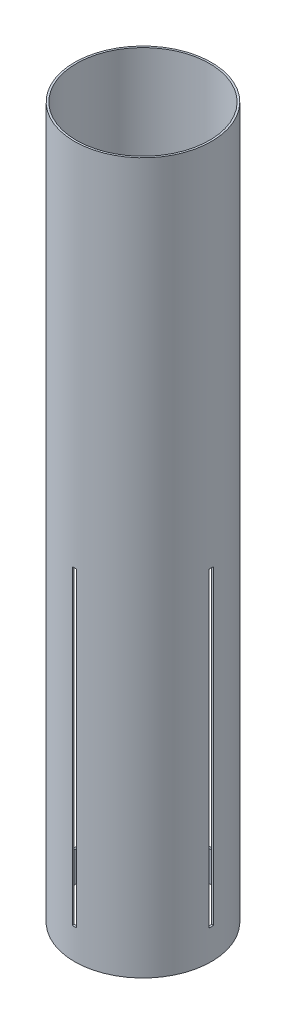
ISO-10303-21;
HEADER;
FILE_DESCRIPTION(('STEP AP214'),'2;1');
FILE_NAME('part.step','',(''),(''),'','','');
FILE_SCHEMA(('AUTOMOTIVE_DESIGN { 1 0 10303 214 1 1 1 1 }'));
ENDSEC;
DATA;
#1=APPLICATION_CONTEXT('core data for automotive mechanical design processes');
#2=APPLICATION_PROTOCOL_DEFINITION('international standard','automotive_design',2000,#1);
#3=PRODUCT_CONTEXT('',#1,'mechanical');
#4=PRODUCT('Part','Part','',(#3));
#5=PRODUCT_RELATED_PRODUCT_CATEGORY('part','',(#4));
#6=PRODUCT_DEFINITION_FORMATION('','',#4);
#7=PRODUCT_DEFINITION_CONTEXT('part definition',#1,'design');
#8=PRODUCT_DEFINITION('design','',#6,#7);
#9=PRODUCT_DEFINITION_SHAPE('','',#8);
#10=(LENGTH_UNIT() NAMED_UNIT(*) SI_UNIT(.MILLI.,.METRE.));
#11=(NAMED_UNIT(*) PLANE_ANGLE_UNIT() SI_UNIT($,.RADIAN.));
#12=(NAMED_UNIT(*) SI_UNIT($,.STERADIAN.) SOLID_ANGLE_UNIT());
#13=UNCERTAINTY_MEASURE_WITH_UNIT(LENGTH_MEASURE(1.E-05),#10,'distance_accuracy_value','');
#14=(GEOMETRIC_REPRESENTATION_CONTEXT(3) GLOBAL_UNCERTAINTY_ASSIGNED_CONTEXT((#13)) GLOBAL_UNIT_ASSIGNED_CONTEXT((#10,
#11,#12)) REPRESENTATION_CONTEXT('',''));
#15=CARTESIAN_POINT('',(0.,0.,0.));
#16=DIRECTION('',(0.,0.,1.));
#17=DIRECTION('',(1.,0.,0.));
#18=AXIS2_PLACEMENT_3D('',#15,#16,#17);
#19=CARTESIAN_POINT('',(0.,812.8,0.));
#20=DIRECTION('',(0.,-1.,0.));
#21=DIRECTION('',(0.,0.,-1.));
#22=AXIS2_PLACEMENT_3D('',#19,#20,#21);
#23=CYLINDRICAL_SURFACE('',#22,78.359);
#24=CARTESIAN_POINT('',(0.,34.671,0.));
#25=DIRECTION('',(0.,1.,0.));
#26=DIRECTION('',(0.,0.,1.));
#27=AXIS2_PLACEMENT_3D('',#24,#25,#26);
#28=CIRCLE('',#27,78.359);
#29=CARTESIAN_POINT('',(-78.3178222437269,34.671,-2.53999999999918));
#30=VERTEX_POINT('',#29);
#31=CARTESIAN_POINT('',(-78.3178222437268,34.671,2.54000000000082));
#32=VERTEX_POINT('',#31);
#33=EDGE_CURVE('E68',#30,#32,#28,.T.);
#34=ORIENTED_EDGE('',*,*,#33,.F.);
#35=DIRECTION('',(0.,-1.,0.));
#36=VECTOR('',#35,1.);
#37=CARTESIAN_POINT('',(-78.3178222437269,812.8,-2.53999999999918));
#38=LINE('',#37,#36);
#39=CARTESIAN_POINT('',(-78.3178222437269,390.271,-2.53999999999918));
#40=VERTEX_POINT('',#39);
#41=EDGE_CURVE('E264',#40,#30,#38,.T.);
#42=ORIENTED_EDGE('',*,*,#41,.F.);
#43=CARTESIAN_POINT('',(0.,390.271,0.));
#44=DIRECTION('',(0.,1.,0.));
#45=DIRECTION('',(0.,0.,1.));
#46=AXIS2_PLACEMENT_3D('',#43,#44,#45);
#47=CIRCLE('',#46,78.359);
#48=CARTESIAN_POINT('',(-78.3178222437268,390.271,2.54000000000082));
#49=VERTEX_POINT('',#48);
#50=EDGE_CURVE('E189',#40,#49,#47,.T.);
#51=ORIENTED_EDGE('',*,*,#50,.T.);
#52=DIRECTION('',(0.,-1.,0.));
#53=VECTOR('',#52,1.);
#54=CARTESIAN_POINT('',(-78.3178222437268,812.8,2.54000000000082));
#55=LINE('',#54,#53);
#56=EDGE_CURVE('E185',#49,#32,#55,.T.);
#57=ORIENTED_EDGE('',*,*,#56,.T.);
#58=EDGE_LOOP('',(#34,#42,#51,#57));
#59=FACE_BOUND('',#58,.T.);
#60=CARTESIAN_POINT('',(0.,0.,0.));
#61=DIRECTION('',(0.,1.,0.));
#62=DIRECTION('',(0.,0.,1.));
#63=AXIS2_PLACEMENT_3D('',#60,#61,#62);
#64=CIRCLE('',#63,78.359);
#65=CARTESIAN_POINT('',(0.,0.,78.359));
#66=VERTEX_POINT('',#65);
#67=EDGE_CURVE('E48',#66,#66,#64,.T.);
#68=ORIENTED_EDGE('',*,*,#67,.T.);
#69=EDGE_LOOP('',(#68));
#70=FACE_BOUND('',#69,.T.);
#71=CARTESIAN_POINT('',(0.,812.8,0.));
#72=DIRECTION('',(0.,1.,0.));
#73=DIRECTION('',(0.,0.,1.));
#74=AXIS2_PLACEMENT_3D('',#71,#72,#73);
#75=CIRCLE('',#74,78.359);
#76=CARTESIAN_POINT('',(0.,812.8,78.359));
#77=VERTEX_POINT('',#76);
#78=EDGE_CURVE('E11',#77,#77,#75,.T.);
#79=ORIENTED_EDGE('',*,*,#78,.F.);
#80=EDGE_LOOP('',(#79));
#81=FACE_BOUND('',#80,.T.);
#82=CARTESIAN_POINT('',(0.,390.271,0.));
#83=DIRECTION('',(0.,1.,0.));
#84=DIRECTION('',(0.,0.,1.));
#85=AXIS2_PLACEMENT_3D('',#82,#83,#84);
#86=CIRCLE('',#85,78.359);
#87=CARTESIAN_POINT('',(-2.54,390.271,78.3178222437269));
#88=VERTEX_POINT('',#87);
#89=CARTESIAN_POINT('',(2.54,390.271,78.3178222437269));
#90=VERTEX_POINT('',#89);
#91=EDGE_CURVE('E326',#88,#90,#86,.T.);
#92=ORIENTED_EDGE('',*,*,#91,.T.);
#93=DIRECTION('',(0.,-1.,0.));
#94=VECTOR('',#93,1.);
#95=CARTESIAN_POINT('',(2.54,812.8,78.3178222437269));
#96=LINE('',#95,#94);
#97=CARTESIAN_POINT('',(2.54,34.671,78.3178222437269));
#98=VERTEX_POINT('',#97);
#99=EDGE_CURVE('E303',#90,#98,#96,.T.);
#100=ORIENTED_EDGE('',*,*,#99,.T.);
#101=CARTESIAN_POINT('',(0.,34.671,0.));
#102=DIRECTION('',(0.,1.,0.));
#103=DIRECTION('',(0.,0.,1.));
#104=AXIS2_PLACEMENT_3D('',#101,#102,#103);
#105=CIRCLE('',#104,78.359);
#106=CARTESIAN_POINT('',(-2.54,34.671,78.3178222437269));
#107=VERTEX_POINT('',#106);
#108=EDGE_CURVE('E333',#107,#98,#105,.T.);
#109=ORIENTED_EDGE('',*,*,#108,.F.);
#110=DIRECTION('',(0.,-1.,0.));
#111=VECTOR('',#110,1.);
#112=CARTESIAN_POINT('',(-2.54,812.8,78.3178222437269));
#113=LINE('',#112,#111);
#114=EDGE_CURVE('E329',#88,#107,#113,.T.);
#115=ORIENTED_EDGE('',*,*,#114,.F.);
#116=EDGE_LOOP('',(#92,#100,#109,#115));
#117=FACE_BOUND('',#116,.T.);
#118=CARTESIAN_POINT('',(0.,390.271,0.));
#119=DIRECTION('',(0.,1.,0.));
#120=DIRECTION('',(0.,0.,1.));
#121=AXIS2_PLACEMENT_3D('',#118,#119,#120);
#122=CIRCLE('',#121,78.359);
#123=CARTESIAN_POINT('',(2.54,390.271,-78.3178222437269));
#124=VERTEX_POINT('',#123);
#125=CARTESIAN_POINT('',(-2.54,390.271,-78.3178222437269));
#126=VERTEX_POINT('',#125);
#127=EDGE_CURVE('E275',#124,#126,#122,.T.);
#128=ORIENTED_EDGE('',*,*,#127,.T.);
#129=DIRECTION('',(0.,-1.,0.));
#130=VECTOR('',#129,1.);
#131=CARTESIAN_POINT('',(-2.54,812.8,-78.3178222437269));
#132=LINE('',#131,#130);
#133=CARTESIAN_POINT('',(-2.54,34.671,-78.3178222437269));
#134=VERTEX_POINT('',#133);
#135=EDGE_CURVE('E278',#126,#134,#132,.T.);
#136=ORIENTED_EDGE('',*,*,#135,.T.);
#137=CARTESIAN_POINT('',(0.,34.671,0.));
#138=DIRECTION('',(0.,1.,0.));
#139=DIRECTION('',(0.,0.,1.));
#140=AXIS2_PLACEMENT_3D('',#137,#138,#139);
#141=CIRCLE('',#140,78.359);
#142=CARTESIAN_POINT('',(2.54,34.671,-78.3178222437269));
#143=VERTEX_POINT('',#142);
#144=EDGE_CURVE('E269',#143,#134,#141,.T.);
#145=ORIENTED_EDGE('',*,*,#144,.F.);
#146=DIRECTION('',(0.,-1.,0.));
#147=VECTOR('',#146,1.);
#148=CARTESIAN_POINT('',(2.54,812.8,-78.3178222437269));
#149=LINE('',#148,#147);
#150=EDGE_CURVE('E272',#124,#143,#149,.T.);
#151=ORIENTED_EDGE('',*,*,#150,.F.);
#152=EDGE_LOOP('',(#128,#136,#145,#151));
#153=FACE_BOUND('',#152,.T.);
#154=CARTESIAN_POINT('',(0.,34.671,0.));
#155=DIRECTION('',(0.,1.,0.));
#156=DIRECTION('',(0.,0.,1.));
#157=AXIS2_PLACEMENT_3D('',#154,#155,#156);
#158=CIRCLE('',#157,78.359);
#159=CARTESIAN_POINT('',(78.3178222437269,34.671,2.53999999999973));
#160=VERTEX_POINT('',#159);
#161=CARTESIAN_POINT('',(78.3178222437269,34.671,-2.54000000000027));
#162=VERTEX_POINT('',#161);
#163=EDGE_CURVE('E60',#160,#162,#158,.T.);
#164=ORIENTED_EDGE('',*,*,#163,.F.);
#165=DIRECTION('',(0.,-1.,0.));
#166=VECTOR('',#165,1.);
#167=CARTESIAN_POINT('',(78.3178222437269,812.8,2.53999999999973));
#168=LINE('',#167,#166);
#169=CARTESIAN_POINT('',(78.3178222437269,390.271,2.53999999999973));
#170=VERTEX_POINT('',#169);
#171=EDGE_CURVE('E177',#170,#160,#168,.T.);
#172=ORIENTED_EDGE('',*,*,#171,.F.);
#173=CARTESIAN_POINT('',(0.,390.271,0.));
#174=DIRECTION('',(0.,1.,0.));
#175=DIRECTION('',(0.,0.,1.));
#176=AXIS2_PLACEMENT_3D('',#173,#174,#175);
#177=CIRCLE('',#176,78.359);
#178=CARTESIAN_POINT('',(78.3178222437269,390.271,-2.54000000000027));
#179=VERTEX_POINT('',#178);
#180=EDGE_CURVE('E286',#170,#179,#177,.T.);
#181=ORIENTED_EDGE('',*,*,#180,.T.);
#182=DIRECTION('',(0.,-1.,0.));
#183=VECTOR('',#182,1.);
#184=CARTESIAN_POINT('',(78.3178222437269,812.8,-2.54000000000027));
#185=LINE('',#184,#183);
#186=EDGE_CURVE('E282',#179,#162,#185,.T.);
#187=ORIENTED_EDGE('',*,*,#186,.T.);
#188=EDGE_LOOP('',(#164,#172,#181,#187));
#189=FACE_BOUND('',#188,.T.);
#190=ADVANCED_FACE('F45',(#59,#70,#81,#117,#153,#189),#23,.T.);
#191=CARTESIAN_POINT('',(0.,812.8,0.));
#192=DIRECTION('',(0.,-1.,0.));
#193=DIRECTION('',(0.,0.,-1.));
#194=AXIS2_PLACEMENT_3D('',#191,#192,#193);
#195=CYLINDRICAL_SURFACE('',#194,76.2);
#196=DIRECTION('',(0.,-1.,0.));
#197=VECTOR('',#196,1.);
#198=CARTESIAN_POINT('',(-2.54,812.8,-76.1576549008699));
#199=LINE('',#198,#197);
#200=CARTESIAN_POINT('',(-2.54,34.671,-76.15765490087));
#201=VERTEX_POINT('',#200);
#202=CARTESIAN_POINT('',(-2.54,390.271,-76.1576549008699));
#203=VERTEX_POINT('',#202);
#204=EDGE_CURVE('E205',#201,#203,#199,.F.);
#205=ORIENTED_EDGE('',*,*,#204,.T.);
#206=CARTESIAN_POINT('',(0.,390.271,0.));
#207=DIRECTION('',(0.,1.,0.));
#208=DIRECTION('',(0.,0.,1.));
#209=AXIS2_PLACEMENT_3D('',#206,#207,#208);
#210=CIRCLE('',#209,76.2);
#211=CARTESIAN_POINT('',(2.54,390.271,-76.1576549008699));
#212=VERTEX_POINT('',#211);
#213=EDGE_CURVE('E217',#203,#212,#210,.F.);
#214=ORIENTED_EDGE('',*,*,#213,.T.);
#215=DIRECTION('',(0.,-1.,0.));
#216=VECTOR('',#215,1.);
#217=CARTESIAN_POINT('',(2.54,812.8,-76.1576549008699));
#218=LINE('',#217,#216);
#219=CARTESIAN_POINT('',(2.54,34.671,-76.1576549008699));
#220=VERTEX_POINT('',#219);
#221=EDGE_CURVE('E210',#220,#212,#218,.F.);
#222=ORIENTED_EDGE('',*,*,#221,.F.);
#223=CARTESIAN_POINT('',(0.,34.671,0.));
#224=DIRECTION('',(0.,1.,0.));
#225=DIRECTION('',(0.,0.,1.));
#226=AXIS2_PLACEMENT_3D('',#223,#224,#225);
#227=CIRCLE('',#226,76.2);
#228=EDGE_CURVE('E211',#201,#220,#227,.F.);
#229=ORIENTED_EDGE('',*,*,#228,.F.);
#230=EDGE_LOOP('',(#205,#214,#222,#229));
#231=FACE_BOUND('',#230,.T.);
#232=CARTESIAN_POINT('',(0.,812.8,0.));
#233=DIRECTION('',(0.,1.,0.));
#234=DIRECTION('',(0.,0.,1.));
#235=AXIS2_PLACEMENT_3D('',#232,#233,#234);
#236=CIRCLE('',#235,76.2);
#237=CARTESIAN_POINT('',(0.,812.8,76.2));
#238=VERTEX_POINT('',#237);
#239=EDGE_CURVE('E338',#238,#238,#236,.T.);
#240=ORIENTED_EDGE('',*,*,#239,.T.);
#241=EDGE_LOOP('',(#240));
#242=FACE_BOUND('',#241,.T.);
#243=CARTESIAN_POINT('',(0.,0.,0.));
#244=DIRECTION('',(0.,1.,0.));
#245=DIRECTION('',(0.,0.,1.));
#246=AXIS2_PLACEMENT_3D('',#243,#244,#245);
#247=CIRCLE('',#246,76.2);
#248=CARTESIAN_POINT('',(0.,0.,76.2));
#249=VERTEX_POINT('',#248);
#250=EDGE_CURVE('E337',#249,#249,#247,.T.);
#251=ORIENTED_EDGE('',*,*,#250,.F.);
#252=EDGE_LOOP('',(#251));
#253=FACE_BOUND('',#252,.T.);
#254=DIRECTION('',(0.,-1.,0.));
#255=VECTOR('',#254,1.);
#256=CARTESIAN_POINT('',(-2.54,812.8,76.1576549008699));
#257=LINE('',#256,#255);
#258=CARTESIAN_POINT('',(-2.54,34.671,76.1576549008699));
#259=VERTEX_POINT('',#258);
#260=CARTESIAN_POINT('',(-2.54,390.271,76.1576549008699));
#261=VERTEX_POINT('',#260);
#262=EDGE_CURVE('E300',#259,#261,#257,.F.);
#263=ORIENTED_EDGE('',*,*,#262,.F.);
#264=CARTESIAN_POINT('',(0.,34.671,0.));
#265=DIRECTION('',(0.,1.,0.));
#266=DIRECTION('',(0.,0.,1.));
#267=AXIS2_PLACEMENT_3D('',#264,#265,#266);
#268=CIRCLE('',#267,76.2);
#269=CARTESIAN_POINT('',(2.54,34.671,76.1576549008699));
#270=VERTEX_POINT('',#269);
#271=EDGE_CURVE('E304',#270,#259,#268,.F.);
#272=ORIENTED_EDGE('',*,*,#271,.F.);
#273=DIRECTION('',(0.,-1.,0.));
#274=VECTOR('',#273,1.);
#275=CARTESIAN_POINT('',(2.54,812.8,76.1576549008699));
#276=LINE('',#275,#274);
#277=CARTESIAN_POINT('',(2.54,390.271,76.1576549008699));
#278=VERTEX_POINT('',#277);
#279=EDGE_CURVE('E294',#270,#278,#276,.F.);
#280=ORIENTED_EDGE('',*,*,#279,.T.);
#281=CARTESIAN_POINT('',(0.,390.271,0.));
#282=DIRECTION('',(0.,1.,0.));
#283=DIRECTION('',(0.,0.,1.));
#284=AXIS2_PLACEMENT_3D('',#281,#282,#283);
#285=CIRCLE('',#284,76.2);
#286=EDGE_CURVE('E313',#278,#261,#285,.F.);
#287=ORIENTED_EDGE('',*,*,#286,.T.);
#288=EDGE_LOOP('',(#263,#272,#280,#287));
#289=FACE_BOUND('',#288,.T.);
#290=DIRECTION('',(0.,-1.,0.));
#291=VECTOR('',#290,1.);
#292=CARTESIAN_POINT('',(-76.15765490087,812.8,-2.5399999999992));
#293=LINE('',#292,#291);
#294=CARTESIAN_POINT('',(-76.15765490087,34.671,-2.5399999999992));
#295=VERTEX_POINT('',#294);
#296=CARTESIAN_POINT('',(-76.15765490087,390.271,-2.5399999999992));
#297=VERTEX_POINT('',#296);
#298=EDGE_CURVE('E214',#295,#297,#293,.F.);
#299=ORIENTED_EDGE('',*,*,#298,.F.);
#300=CARTESIAN_POINT('',(0.,34.671,0.));
#301=DIRECTION('',(0.,1.,0.));
#302=DIRECTION('',(0.,0.,1.));
#303=AXIS2_PLACEMENT_3D('',#300,#301,#302);
#304=CIRCLE('',#303,76.2);
#305=CARTESIAN_POINT('',(-76.1576549008699,34.671,2.5400000000008));
#306=VERTEX_POINT('',#305);
#307=EDGE_CURVE('E243',#306,#295,#304,.F.);
#308=ORIENTED_EDGE('',*,*,#307,.F.);
#309=DIRECTION('',(0.,-1.,0.));
#310=VECTOR('',#309,1.);
#311=CARTESIAN_POINT('',(-76.1576549008699,812.8,2.5400000000008));
#312=LINE('',#311,#310);
#313=CARTESIAN_POINT('',(-76.1576549008699,390.271,2.5400000000008));
#314=VERTEX_POINT('',#313);
#315=EDGE_CURVE('E235',#306,#314,#312,.F.);
#316=ORIENTED_EDGE('',*,*,#315,.T.);
#317=CARTESIAN_POINT('',(0.,390.271,0.));
#318=DIRECTION('',(0.,1.,0.));
#319=DIRECTION('',(0.,0.,1.));
#320=AXIS2_PLACEMENT_3D('',#317,#318,#319);
#321=CIRCLE('',#320,76.2);
#322=EDGE_CURVE('E252',#314,#297,#321,.F.);
#323=ORIENTED_EDGE('',*,*,#322,.T.);
#324=EDGE_LOOP('',(#299,#308,#316,#323));
#325=FACE_BOUND('',#324,.T.);
#326=DIRECTION('',(0.,-1.,0.));
#327=VECTOR('',#326,1.);
#328=CARTESIAN_POINT('',(76.15765490087,812.8,2.53999999999973));
#329=LINE('',#328,#327);
#330=CARTESIAN_POINT('',(76.15765490087,34.671,2.53999999999973));
#331=VERTEX_POINT('',#330);
#332=CARTESIAN_POINT('',(76.15765490087,390.271,2.53999999999973));
#333=VERTEX_POINT('',#332);
#334=EDGE_CURVE('E169',#331,#333,#329,.F.);
#335=ORIENTED_EDGE('',*,*,#334,.F.);
#336=CARTESIAN_POINT('',(0.,34.671,0.));
#337=DIRECTION('',(0.,1.,0.));
#338=DIRECTION('',(0.,0.,1.));
#339=AXIS2_PLACEMENT_3D('',#336,#337,#338);
#340=CIRCLE('',#339,76.2);
#341=CARTESIAN_POINT('',(76.1576549008699,34.671,-2.54000000000027));
#342=VERTEX_POINT('',#341);
#343=EDGE_CURVE('E160',#342,#331,#340,.F.);
#344=ORIENTED_EDGE('',*,*,#343,.F.);
#345=DIRECTION('',(0.,-1.,0.));
#346=VECTOR('',#345,1.);
#347=CARTESIAN_POINT('',(76.1576549008699,812.8,-2.54000000000027));
#348=LINE('',#347,#346);
#349=CARTESIAN_POINT('',(76.1576549008699,390.271,-2.54000000000027));
#350=VERTEX_POINT('',#349);
#351=EDGE_CURVE('E192',#342,#350,#348,.F.);
#352=ORIENTED_EDGE('',*,*,#351,.T.);
#353=CARTESIAN_POINT('',(0.,390.271,0.));
#354=DIRECTION('',(0.,1.,0.));
#355=DIRECTION('',(0.,0.,1.));
#356=AXIS2_PLACEMENT_3D('',#353,#354,#355);
#357=CIRCLE('',#356,76.2);
#358=EDGE_CURVE('E179',#350,#333,#357,.F.);
#359=ORIENTED_EDGE('',*,*,#358,.T.);
#360=EDGE_LOOP('',(#335,#344,#352,#359));
#361=FACE_BOUND('',#360,.T.);
#362=ADVANCED_FACE('F182',(#231,#242,#253,#289,#325,#361),#195,.F.);
#363=CARTESIAN_POINT('',(0.,812.8,0.));
#364=DIRECTION('',(0.,1.,0.));
#365=DIRECTION('',(0.,0.,1.));
#366=AXIS2_PLACEMENT_3D('',#363,#364,#365);
#367=PLANE('',#366);
#368=ORIENTED_EDGE('',*,*,#78,.T.);
#369=EDGE_LOOP('',(#368));
#370=FACE_BOUND('',#369,.T.);
#371=ORIENTED_EDGE('',*,*,#239,.F.);
#372=EDGE_LOOP('',(#371));
#373=FACE_BOUND('',#372,.T.);
#374=ADVANCED_FACE('F350',(#370,#373),#367,.T.);
#375=CARTESIAN_POINT('',(0.,0.,0.));
#376=DIRECTION('',(0.,1.,0.));
#377=DIRECTION('',(0.,0.,1.));
#378=AXIS2_PLACEMENT_3D('',#375,#376,#377);
#379=PLANE('',#378);
#380=ORIENTED_EDGE('',*,*,#67,.F.);
#381=EDGE_LOOP('',(#380));
#382=FACE_BOUND('',#381,.T.);
#383=ORIENTED_EDGE('',*,*,#250,.T.);
#384=EDGE_LOOP('',(#383));
#385=FACE_BOUND('',#384,.T.);
#386=ADVANCED_FACE('F346',(#382,#385),#379,.F.);
#387=CARTESIAN_POINT('',(0.,34.671,-78.36));
#388=DIRECTION('',(0.,1.,0.));
#389=DIRECTION('',(0.,0.,1.));
#390=AXIS2_PLACEMENT_3D('',#387,#388,#389);
#391=PLANE('',#390);
#392=ORIENTED_EDGE('',*,*,#108,.T.);
#393=DIRECTION('',(0.,0.,1.));
#394=VECTOR('',#393,1.);
#395=CARTESIAN_POINT('',(2.54,34.671,-78.36));
#396=LINE('',#395,#394);
#397=EDGE_CURVE('E293',#270,#98,#396,.T.);
#398=ORIENTED_EDGE('',*,*,#397,.F.);
#399=ORIENTED_EDGE('',*,*,#271,.T.);
#400=DIRECTION('',(0.,0.,1.));
#401=VECTOR('',#400,1.);
#402=CARTESIAN_POINT('',(-2.54,34.671,-78.36));
#403=LINE('',#402,#401);
#404=EDGE_CURVE('E309',#259,#107,#403,.T.);
#405=ORIENTED_EDGE('',*,*,#404,.T.);
#406=EDGE_LOOP('',(#392,#398,#399,#405));
#407=FACE_BOUND('',#406,.T.);
#408=ADVANCED_FACE('F415',(#407),#391,.T.);
#409=CARTESIAN_POINT('',(-2.54,0.,-78.36));
#410=DIRECTION('',(1.,0.,0.));
#411=DIRECTION('',(0.,0.,-1.));
#412=AXIS2_PLACEMENT_3D('',#409,#410,#411);
#413=PLANE('',#412);
#414=ORIENTED_EDGE('',*,*,#114,.T.);
#415=ORIENTED_EDGE('',*,*,#404,.F.);
#416=ORIENTED_EDGE('',*,*,#262,.T.);
#417=DIRECTION('',(0.,0.,1.));
#418=VECTOR('',#417,1.);
#419=CARTESIAN_POINT('',(-2.54,390.271,-78.36));
#420=LINE('',#419,#418);
#421=EDGE_CURVE('E299',#261,#88,#420,.T.);
#422=ORIENTED_EDGE('',*,*,#421,.T.);
#423=EDGE_LOOP('',(#414,#415,#416,#422));
#424=FACE_BOUND('',#423,.T.);
#425=ADVANCED_FACE('F406',(#424),#413,.T.);
#426=CARTESIAN_POINT('',(0.,390.271,-78.36));
#427=DIRECTION('',(0.,1.,0.));
#428=DIRECTION('',(0.,0.,1.));
#429=AXIS2_PLACEMENT_3D('',#426,#427,#428);
#430=PLANE('',#429);
#431=ORIENTED_EDGE('',*,*,#91,.F.);
#432=ORIENTED_EDGE('',*,*,#421,.F.);
#433=ORIENTED_EDGE('',*,*,#286,.F.);
#434=DIRECTION('',(0.,0.,1.));
#435=VECTOR('',#434,1.);
#436=CARTESIAN_POINT('',(2.54,390.271,-78.36));
#437=LINE('',#436,#435);
#438=EDGE_CURVE('E298',#278,#90,#437,.T.);
#439=ORIENTED_EDGE('',*,*,#438,.T.);
#440=EDGE_LOOP('',(#431,#432,#433,#439));
#441=FACE_BOUND('',#440,.T.);
#442=ADVANCED_FACE('F380',(#441),#430,.F.);
#443=CARTESIAN_POINT('',(2.54,0.,-78.36));
#444=DIRECTION('',(1.,0.,0.));
#445=DIRECTION('',(0.,0.,-1.));
#446=AXIS2_PLACEMENT_3D('',#443,#444,#445);
#447=PLANE('',#446);
#448=ORIENTED_EDGE('',*,*,#438,.F.);
#449=ORIENTED_EDGE('',*,*,#279,.F.);
#450=ORIENTED_EDGE('',*,*,#397,.T.);
#451=ORIENTED_EDGE('',*,*,#99,.F.);
#452=EDGE_LOOP('',(#448,#449,#450,#451));
#453=FACE_BOUND('',#452,.T.);
#454=ADVANCED_FACE('F373',(#453),#447,.F.);
#455=CARTESIAN_POINT('',(78.3600000000008,34.671,-8.20777433135252E-13));
#456=DIRECTION('',(0.,1.,0.));
#457=DIRECTION('',(0.,0.,1.));
#458=AXIS2_PLACEMENT_3D('',#455,#456,#457);
#459=PLANE('',#458);
#460=ORIENTED_EDGE('',*,*,#33,.T.);
#461=DIRECTION('',(-1.,0.,0.));
#462=VECTOR('',#461,1.);
#463=CARTESIAN_POINT('',(78.3600000000009,34.671,2.53999999999918));
#464=LINE('',#463,#462);
#465=EDGE_CURVE('E246',#306,#32,#464,.T.);
#466=ORIENTED_EDGE('',*,*,#465,.F.);
#467=ORIENTED_EDGE('',*,*,#307,.T.);
#468=DIRECTION('',(-1.,0.,0.));
#469=VECTOR('',#468,1.);
#470=CARTESIAN_POINT('',(78.3600000000008,34.671,-2.54000000000082));
#471=LINE('',#470,#469);
#472=EDGE_CURVE('E249',#295,#30,#471,.T.);
#473=ORIENTED_EDGE('',*,*,#472,.T.);
#474=EDGE_LOOP('',(#460,#466,#467,#473));
#475=FACE_BOUND('',#474,.T.);
#476=ADVANCED_FACE('F371',(#475),#459,.T.);
#477=CARTESIAN_POINT('',(78.3600000000008,0.,-2.54000000000082));
#478=DIRECTION('',(0.,0.,1.));
#479=DIRECTION('',(1.,0.,0.));
#480=AXIS2_PLACEMENT_3D('',#477,#478,#479);
#481=PLANE('',#480);
#482=ORIENTED_EDGE('',*,*,#41,.T.);
#483=ORIENTED_EDGE('',*,*,#472,.F.);
#484=ORIENTED_EDGE('',*,*,#298,.T.);
#485=DIRECTION('',(-1.,0.,0.));
#486=VECTOR('',#485,1.);
#487=CARTESIAN_POINT('',(78.3600000000008,390.271,-2.54000000000082));
#488=LINE('',#487,#486);
#489=EDGE_CURVE('E240',#297,#40,#488,.T.);
#490=ORIENTED_EDGE('',*,*,#489,.T.);
#491=EDGE_LOOP('',(#482,#483,#484,#490));
#492=FACE_BOUND('',#491,.T.);
#493=ADVANCED_FACE('F362',(#492),#481,.T.);
#494=CARTESIAN_POINT('',(78.3600000000008,390.271,-8.20777433135252E-13));
#495=DIRECTION('',(0.,1.,0.));
#496=DIRECTION('',(0.,0.,1.));
#497=AXIS2_PLACEMENT_3D('',#494,#495,#496);
#498=PLANE('',#497);
#499=ORIENTED_EDGE('',*,*,#489,.F.);
#500=ORIENTED_EDGE('',*,*,#322,.F.);
#501=DIRECTION('',(-1.,0.,0.));
#502=VECTOR('',#501,1.);
#503=CARTESIAN_POINT('',(78.3600000000009,390.271,2.53999999999918));
#504=LINE('',#503,#502);
#505=EDGE_CURVE('E239',#314,#49,#504,.T.);
#506=ORIENTED_EDGE('',*,*,#505,.T.);
#507=ORIENTED_EDGE('',*,*,#50,.F.);
#508=EDGE_LOOP('',(#499,#500,#506,#507));
#509=FACE_BOUND('',#508,.T.);
#510=ADVANCED_FACE('F365',(#509),#498,.F.);
#511=CARTESIAN_POINT('',(78.3600000000009,0.,2.53999999999918));
#512=DIRECTION('',(0.,0.,1.));
#513=DIRECTION('',(1.,0.,0.));
#514=AXIS2_PLACEMENT_3D('',#511,#512,#513);
#515=PLANE('',#514);
#516=ORIENTED_EDGE('',*,*,#505,.F.);
#517=ORIENTED_EDGE('',*,*,#315,.F.);
#518=ORIENTED_EDGE('',*,*,#465,.T.);
#519=ORIENTED_EDGE('',*,*,#56,.F.);
#520=EDGE_LOOP('',(#516,#517,#518,#519));
#521=FACE_BOUND('',#520,.T.);
#522=ADVANCED_FACE('F370',(#521),#515,.F.);
#523=CARTESIAN_POINT('',(-2.54,0.,78.36));
#524=DIRECTION('',(-1.,0.,0.));
#525=DIRECTION('',(0.,0.,1.));
#526=AXIS2_PLACEMENT_3D('',#523,#524,#525);
#527=PLANE('',#526);
#528=DIRECTION('',(0.,0.,-1.));
#529=VECTOR('',#528,1.);
#530=CARTESIAN_POINT('',(-2.54,390.271,78.36));
#531=LINE('',#530,#529);
#532=EDGE_CURVE('E209',#203,#126,#531,.T.);
#533=ORIENTED_EDGE('',*,*,#532,.F.);
#534=ORIENTED_EDGE('',*,*,#204,.F.);
#535=DIRECTION('',(0.,0.,-1.));
#536=VECTOR('',#535,1.);
#537=CARTESIAN_POINT('',(-2.54,34.671,78.36));
#538=LINE('',#537,#536);
#539=EDGE_CURVE('E195',#201,#134,#538,.T.);
#540=ORIENTED_EDGE('',*,*,#539,.T.);
#541=ORIENTED_EDGE('',*,*,#135,.F.);
#542=EDGE_LOOP('',(#533,#534,#540,#541));
#543=FACE_BOUND('',#542,.T.);
#544=ADVANCED_FACE('F487',(#543),#527,.F.);
#545=CARTESIAN_POINT('',(0.,390.271,78.36));
#546=DIRECTION('',(0.,1.,0.));
#547=DIRECTION('',(0.,0.,1.));
#548=AXIS2_PLACEMENT_3D('',#545,#546,#547);
#549=PLANE('',#548);
#550=DIRECTION('',(0.,0.,-1.));
#551=VECTOR('',#550,1.);
#552=CARTESIAN_POINT('',(2.54,390.271,78.36));
#553=LINE('',#552,#551);
#554=EDGE_CURVE('E221',#212,#124,#553,.T.);
#555=ORIENTED_EDGE('',*,*,#554,.F.);
#556=ORIENTED_EDGE('',*,*,#213,.F.);
#557=ORIENTED_EDGE('',*,*,#532,.T.);
#558=ORIENTED_EDGE('',*,*,#127,.F.);
#559=EDGE_LOOP('',(#555,#556,#557,#558));
#560=FACE_BOUND('',#559,.T.);
#561=ADVANCED_FACE('F483',(#560),#549,.F.);
#562=CARTESIAN_POINT('',(2.54,0.,78.36));
#563=DIRECTION('',(-1.,0.,0.));
#564=DIRECTION('',(0.,0.,1.));
#565=AXIS2_PLACEMENT_3D('',#562,#563,#564);
#566=PLANE('',#565);
#567=ORIENTED_EDGE('',*,*,#150,.T.);
#568=DIRECTION('',(0.,0.,-1.));
#569=VECTOR('',#568,1.);
#570=CARTESIAN_POINT('',(2.54,34.671,78.36));
#571=LINE('',#570,#569);
#572=EDGE_CURVE('E222',#220,#143,#571,.T.);
#573=ORIENTED_EDGE('',*,*,#572,.F.);
#574=ORIENTED_EDGE('',*,*,#221,.T.);
#575=ORIENTED_EDGE('',*,*,#554,.T.);
#576=EDGE_LOOP('',(#567,#573,#574,#575));
#577=FACE_BOUND('',#576,.T.);
#578=ADVANCED_FACE('F479',(#577),#566,.T.);
#579=CARTESIAN_POINT('',(0.,34.671,78.36));
#580=DIRECTION('',(0.,1.,0.));
#581=DIRECTION('',(0.,0.,1.));
#582=AXIS2_PLACEMENT_3D('',#579,#580,#581);
#583=PLANE('',#582);
#584=ORIENTED_EDGE('',*,*,#144,.T.);
#585=ORIENTED_EDGE('',*,*,#539,.F.);
#586=ORIENTED_EDGE('',*,*,#228,.T.);
#587=ORIENTED_EDGE('',*,*,#572,.T.);
#588=EDGE_LOOP('',(#584,#585,#586,#587));
#589=FACE_BOUND('',#588,.T.);
#590=ADVANCED_FACE('F476',(#589),#583,.T.);
#591=CARTESIAN_POINT('',(-78.3600000000003,34.671,2.73592477711749E-13));
#592=DIRECTION('',(0.,1.,0.));
#593=DIRECTION('',(0.,0.,1.));
#594=AXIS2_PLACEMENT_3D('',#591,#592,#593);
#595=PLANE('',#594);
#596=ORIENTED_EDGE('',*,*,#163,.T.);
#597=DIRECTION('',(1.,0.,0.));
#598=VECTOR('',#597,1.);
#599=CARTESIAN_POINT('',(-78.3600000000003,34.671,-2.53999999999973));
#600=LINE('',#599,#598);
#601=EDGE_CURVE('E164',#342,#162,#600,.T.);
#602=ORIENTED_EDGE('',*,*,#601,.F.);
#603=ORIENTED_EDGE('',*,*,#343,.T.);
#604=DIRECTION('',(1.,0.,0.));
#605=VECTOR('',#604,1.);
#606=CARTESIAN_POINT('',(-78.3600000000003,34.671,2.54000000000027));
#607=LINE('',#606,#605);
#608=EDGE_CURVE('E163',#331,#160,#607,.T.);
#609=ORIENTED_EDGE('',*,*,#608,.T.);
#610=EDGE_LOOP('',(#596,#602,#603,#609));
#611=FACE_BOUND('',#610,.T.);
#612=ADVANCED_FACE('F162',(#611),#595,.T.);
#613=CARTESIAN_POINT('',(-78.3600000000003,0.,2.54000000000027));
#614=DIRECTION('',(0.,0.,-1.));
#615=DIRECTION('',(-1.,0.,0.));
#616=AXIS2_PLACEMENT_3D('',#613,#614,#615);
#617=PLANE('',#616);
#618=ORIENTED_EDGE('',*,*,#171,.T.);
#619=ORIENTED_EDGE('',*,*,#608,.F.);
#620=ORIENTED_EDGE('',*,*,#334,.T.);
#621=DIRECTION('',(1.,0.,0.));
#622=VECTOR('',#621,1.);
#623=CARTESIAN_POINT('',(-78.3600000000003,390.271,2.54000000000027));
#624=LINE('',#623,#622);
#625=EDGE_CURVE('E199',#333,#170,#624,.T.);
#626=ORIENTED_EDGE('',*,*,#625,.T.);
#627=EDGE_LOOP('',(#618,#619,#620,#626));
#628=FACE_BOUND('',#627,.T.);
#629=ADVANCED_FACE('F173',(#628),#617,.T.);
#630=CARTESIAN_POINT('',(-78.3600000000003,390.271,2.73592477711749E-13));
#631=DIRECTION('',(0.,1.,0.));
#632=DIRECTION('',(0.,0.,1.));
#633=AXIS2_PLACEMENT_3D('',#630,#631,#632);
#634=PLANE('',#633);
#635=ORIENTED_EDGE('',*,*,#625,.F.);
#636=ORIENTED_EDGE('',*,*,#358,.F.);
#637=DIRECTION('',(1.,0.,0.));
#638=VECTOR('',#637,1.);
#639=CARTESIAN_POINT('',(-78.3600000000003,390.271,-2.53999999999973));
#640=LINE('',#639,#638);
#641=EDGE_CURVE('E170',#350,#179,#640,.T.);
#642=ORIENTED_EDGE('',*,*,#641,.T.);
#643=ORIENTED_EDGE('',*,*,#180,.F.);
#644=EDGE_LOOP('',(#635,#636,#642,#643));
#645=FACE_BOUND('',#644,.T.);
#646=ADVANCED_FACE('F463',(#645),#634,.F.);
#647=CARTESIAN_POINT('',(-78.3600000000003,0.,-2.53999999999973));
#648=DIRECTION('',(0.,0.,-1.));
#649=DIRECTION('',(-1.,0.,0.));
#650=AXIS2_PLACEMENT_3D('',#647,#648,#649);
#651=PLANE('',#650);
#652=ORIENTED_EDGE('',*,*,#641,.F.);
#653=ORIENTED_EDGE('',*,*,#351,.F.);
#654=ORIENTED_EDGE('',*,*,#601,.T.);
#655=ORIENTED_EDGE('',*,*,#186,.F.);
#656=EDGE_LOOP('',(#652,#653,#654,#655));
#657=FACE_BOUND('',#656,.T.);
#658=ADVANCED_FACE('F461',(#657),#651,.F.);
#659=CLOSED_SHELL('',(#190,#362,#374,#386,#408,#425,#442,#454,#476,#493,#510,#522,#544,#561,
#578,#590,#612,#629,#646,#658));
#660=MANIFOLD_SOLID_BREP('B2',#659);
#661=ADVANCED_BREP_SHAPE_REPRESENTATION('',(#18,#660),#14);
#662=SHAPE_DEFINITION_REPRESENTATION(#9,#661);
ENDSEC;
END-ISO-10303-21;
